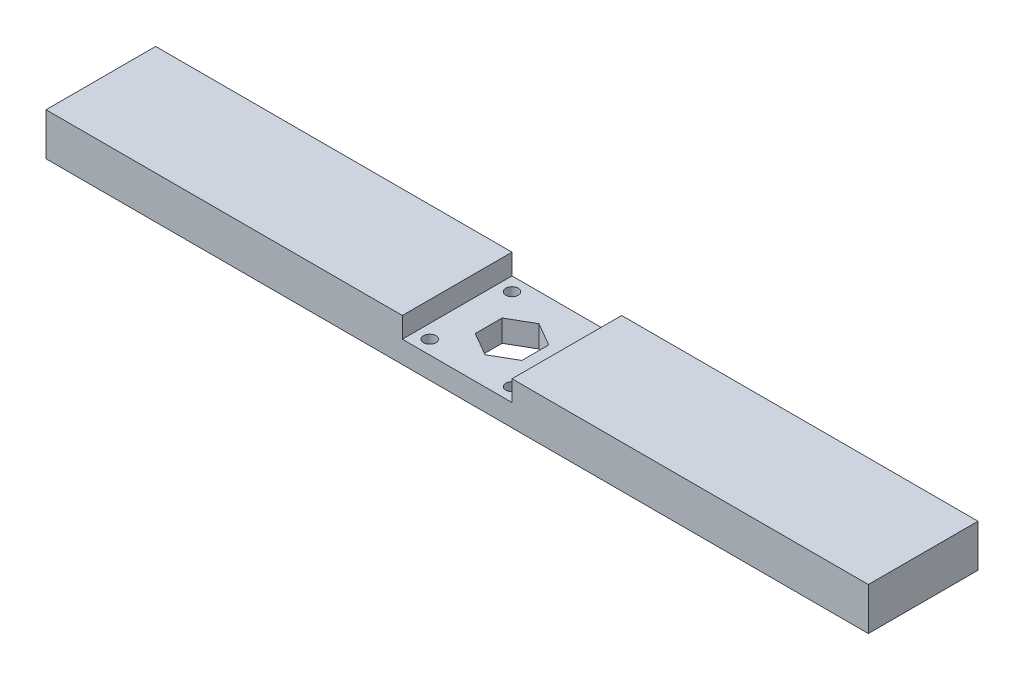
ISO-10303-21;
HEADER;
FILE_DESCRIPTION(('STEP AP214'),'2;1');
FILE_NAME('part.step','',(''),(''),'','','');
FILE_SCHEMA(('AUTOMOTIVE_DESIGN { 1 0 10303 214 1 1 1 1 }'));
ENDSEC;
DATA;
#1=APPLICATION_CONTEXT('core data for automotive mechanical design processes');
#2=APPLICATION_PROTOCOL_DEFINITION('international standard','automotive_design',2000,#1);
#3=PRODUCT_CONTEXT('',#1,'mechanical');
#4=PRODUCT('Part','Part','',(#3));
#5=PRODUCT_RELATED_PRODUCT_CATEGORY('part','',(#4));
#6=PRODUCT_DEFINITION_FORMATION('','',#4);
#7=PRODUCT_DEFINITION_CONTEXT('part definition',#1,'design');
#8=PRODUCT_DEFINITION('design','',#6,#7);
#9=PRODUCT_DEFINITION_SHAPE('','',#8);
#10=(LENGTH_UNIT() NAMED_UNIT(*) SI_UNIT(.MILLI.,.METRE.));
#11=(NAMED_UNIT(*) PLANE_ANGLE_UNIT() SI_UNIT($,.RADIAN.));
#12=(NAMED_UNIT(*) SI_UNIT($,.STERADIAN.) SOLID_ANGLE_UNIT());
#13=UNCERTAINTY_MEASURE_WITH_UNIT(LENGTH_MEASURE(1.E-05),#10,'distance_accuracy_value','');
#14=(GEOMETRIC_REPRESENTATION_CONTEXT(3) GLOBAL_UNCERTAINTY_ASSIGNED_CONTEXT((#13)) GLOBAL_UNIT_ASSIGNED_CONTEXT((#10,
#11,#12)) REPRESENTATION_CONTEXT('',''));
#15=CARTESIAN_POINT('',(0.,0.,0.));
#16=DIRECTION('',(0.,0.,1.));
#17=DIRECTION('',(1.,0.,0.));
#18=AXIS2_PLACEMENT_3D('',#15,#16,#17);
#19=CARTESIAN_POINT('',(-150.,7.75,20.));
#20=DIRECTION('',(0.,-1.,0.));
#21=DIRECTION('',(0.,0.,-1.));
#22=AXIS2_PLACEMENT_3D('',#19,#20,#21);
#23=PLANE('',#22);
#24=DIRECTION('',(-1.,0.,0.));
#25=VECTOR('',#24,1.);
#26=CARTESIAN_POINT('',(-150.,7.75,-20.));
#27=LINE('',#26,#25);
#28=CARTESIAN_POINT('',(-20.,7.75,-20.));
#29=VERTEX_POINT('',#28);
#30=CARTESIAN_POINT('',(-150.,7.75,-20.));
#31=VERTEX_POINT('',#30);
#32=EDGE_CURVE('E209',#29,#31,#27,.T.);
#33=ORIENTED_EDGE('',*,*,#32,.T.);
#34=DIRECTION('',(0.,0.,-1.));
#35=VECTOR('',#34,1.);
#36=CARTESIAN_POINT('',(-150.,7.75,20.));
#37=LINE('',#36,#35);
#38=CARTESIAN_POINT('',(-150.,7.75,20.));
#39=VERTEX_POINT('',#38);
#40=EDGE_CURVE('E11',#39,#31,#37,.T.);
#41=ORIENTED_EDGE('',*,*,#40,.F.);
#42=DIRECTION('',(-1.,0.,0.));
#43=VECTOR('',#42,1.);
#44=CARTESIAN_POINT('',(-150.,7.75,20.));
#45=LINE('',#44,#43);
#46=CARTESIAN_POINT('',(-20.,7.75,20.));
#47=VERTEX_POINT('',#46);
#48=EDGE_CURVE('E210',#47,#39,#45,.T.);
#49=ORIENTED_EDGE('',*,*,#48,.F.);
#50=DIRECTION('',(0.,0.,-1.));
#51=VECTOR('',#50,1.);
#52=CARTESIAN_POINT('',(-20.,7.75,20.));
#53=LINE('',#52,#51);
#54=EDGE_CURVE('E228',#47,#29,#53,.T.);
#55=ORIENTED_EDGE('',*,*,#54,.T.);
#56=EDGE_LOOP('',(#33,#41,#49,#55));
#57=FACE_BOUND('',#56,.T.);
#58=ADVANCED_FACE('F33',(#57),#23,.F.);
#59=CARTESIAN_POINT('',(-150.,7.75,20.));
#60=DIRECTION('',(1.,0.,0.));
#61=DIRECTION('',(0.,0.,-1.));
#62=AXIS2_PLACEMENT_3D('',#59,#60,#61);
#63=PLANE('',#62);
#64=DIRECTION('',(0.,-1.,0.));
#65=VECTOR('',#64,1.);
#66=CARTESIAN_POINT('',(-150.,7.75,-20.));
#67=LINE('',#66,#65);
#68=CARTESIAN_POINT('',(-150.,-7.75,-20.));
#69=VERTEX_POINT('',#68);
#70=EDGE_CURVE('E231',#31,#69,#67,.T.);
#71=ORIENTED_EDGE('',*,*,#70,.T.);
#72=DIRECTION('',(0.,0.,-1.));
#73=VECTOR('',#72,1.);
#74=CARTESIAN_POINT('',(-150.,-7.75,20.));
#75=LINE('',#74,#73);
#76=CARTESIAN_POINT('',(-150.,-7.75,20.));
#77=VERTEX_POINT('',#76);
#78=EDGE_CURVE('E40',#77,#69,#75,.T.);
#79=ORIENTED_EDGE('',*,*,#78,.F.);
#80=DIRECTION('',(0.,-1.,0.));
#81=VECTOR('',#80,1.);
#82=CARTESIAN_POINT('',(-150.,7.75,20.));
#83=LINE('',#82,#81);
#84=EDGE_CURVE('E213',#39,#77,#83,.T.);
#85=ORIENTED_EDGE('',*,*,#84,.F.);
#86=ORIENTED_EDGE('',*,*,#40,.T.);
#87=EDGE_LOOP('',(#71,#79,#85,#86));
#88=FACE_BOUND('',#87,.T.);
#89=ADVANCED_FACE('F288',(#88),#63,.F.);
#90=CARTESIAN_POINT('',(-150.,-7.75,20.));
#91=DIRECTION('',(0.,1.,0.));
#92=DIRECTION('',(-1.,0.,0.));
#93=AXIS2_PLACEMENT_3D('',#90,#91,#92);
#94=PLANE('',#93);
#95=CARTESIAN_POINT('',(-15.,-7.75000000000001,-15.));
#96=DIRECTION('',(0.,1.,0.));
#97=DIRECTION('',(-1.,0.,0.));
#98=AXIS2_PLACEMENT_3D('',#95,#96,#97);
#99=CIRCLE('',#98,2.25);
#100=CARTESIAN_POINT('',(-17.25,-7.75000000000001,-15.));
#101=VERTEX_POINT('',#100);
#102=EDGE_CURVE('E206',#101,#101,#99,.T.);
#103=ORIENTED_EDGE('',*,*,#102,.T.);
#104=EDGE_LOOP('',(#103));
#105=FACE_BOUND('',#104,.T.);
#106=CARTESIAN_POINT('',(15.,-7.75000000000002,15.));
#107=DIRECTION('',(0.,1.,0.));
#108=DIRECTION('',(-1.,0.,0.));
#109=AXIS2_PLACEMENT_3D('',#106,#107,#108);
#110=CIRCLE('',#109,2.25);
#111=CARTESIAN_POINT('',(12.75,-7.75000000000002,15.));
#112=VERTEX_POINT('',#111);
#113=EDGE_CURVE('E203',#112,#112,#110,.T.);
#114=ORIENTED_EDGE('',*,*,#113,.T.);
#115=EDGE_LOOP('',(#114));
#116=FACE_BOUND('',#115,.T.);
#117=CARTESIAN_POINT('',(-15.,-7.75000000000001,15.));
#118=DIRECTION('',(0.,1.,0.));
#119=DIRECTION('',(-1.,0.,0.));
#120=AXIS2_PLACEMENT_3D('',#117,#118,#119);
#121=CIRCLE('',#120,2.25);
#122=CARTESIAN_POINT('',(-17.25,-7.75000000000001,15.));
#123=VERTEX_POINT('',#122);
#124=EDGE_CURVE('E200',#123,#123,#121,.T.);
#125=ORIENTED_EDGE('',*,*,#124,.T.);
#126=EDGE_LOOP('',(#125));
#127=FACE_BOUND('',#126,.T.);
#128=DIRECTION('',(0.,0.,1.));
#129=VECTOR('',#128,1.);
#130=CARTESIAN_POINT('',(-8.50000000000001,-7.75000000000002,20.));
#131=LINE('',#130,#129);
#132=CARTESIAN_POINT('',(-8.5,-7.75000000000001,-4.90747728811182));
#133=VERTEX_POINT('',#132);
#134=CARTESIAN_POINT('',(-8.5,-7.75000000000001,4.90747728811182));
#135=VERTEX_POINT('',#134);
#136=EDGE_CURVE('E194',#133,#135,#131,.T.);
#137=ORIENTED_EDGE('',*,*,#136,.T.);
#138=DIRECTION('',(0.866025403784439,0.,0.5));
#139=VECTOR('',#138,1.);
#140=CARTESIAN_POINT('',(-108.089745962156,-7.75000000000001,-52.5906893516652));
#141=LINE('',#140,#139);
#142=CARTESIAN_POINT('',(0.,-7.75000000000002,9.81495457622364));
#143=VERTEX_POINT('',#142);
#144=EDGE_CURVE('E197',#135,#143,#141,.T.);
#145=ORIENTED_EDGE('',*,*,#144,.T.);
#146=DIRECTION('',(0.866025403784438,0.,-0.500000000000001));
#147=VECTOR('',#146,1.);
#148=CARTESIAN_POINT('',(-116.910254037844,-7.75,77.3131212160007));
#149=LINE('',#148,#147);
#150=CARTESIAN_POINT('',(8.50000000000001,-7.75000000000002,4.90747728811182));
#151=VERTEX_POINT('',#150);
#152=EDGE_CURVE('E185',#143,#151,#149,.T.);
#153=ORIENTED_EDGE('',*,*,#152,.T.);
#154=DIRECTION('',(0.,0.,-1.));
#155=VECTOR('',#154,1.);
#156=CARTESIAN_POINT('',(8.50000000000001,-7.75000000000002,20.));
#157=LINE('',#156,#155);
#158=CARTESIAN_POINT('',(8.5,-7.75000000000002,-4.90747728811182));
#159=VERTEX_POINT('',#158);
#160=EDGE_CURVE('E139',#151,#159,#157,.T.);
#161=ORIENTED_EDGE('',*,*,#160,.T.);
#162=DIRECTION('',(-0.866025403784439,0.,-0.5));
#163=VECTOR('',#162,1.);
#164=CARTESIAN_POINT('',(-99.5897459621556,-7.75000000000001,-67.3131212160007));
#165=LINE('',#164,#163);
#166=CARTESIAN_POINT('',(0.,-7.75000000000002,-9.81495457622364));
#167=VERTEX_POINT('',#166);
#168=EDGE_CURVE('E188',#159,#167,#165,.T.);
#169=ORIENTED_EDGE('',*,*,#168,.T.);
#170=DIRECTION('',(-0.866025403784439,0.,0.5));
#171=VECTOR('',#170,1.);
#172=CARTESIAN_POINT('',(-125.410254037844,-7.75,62.5906893516652));
#173=LINE('',#172,#171);
#174=EDGE_CURVE('E191',#167,#133,#173,.T.);
#175=ORIENTED_EDGE('',*,*,#174,.T.);
#176=EDGE_LOOP('',(#137,#145,#153,#161,#169,#175));
#177=FACE_BOUND('',#176,.T.);
#178=CARTESIAN_POINT('',(15.,-7.75000000000002,-15.));
#179=DIRECTION('',(0.,1.,0.));
#180=DIRECTION('',(-1.,0.,0.));
#181=AXIS2_PLACEMENT_3D('',#178,#179,#180);
#182=CIRCLE('',#181,2.25);
#183=CARTESIAN_POINT('',(12.75,-7.75000000000002,-15.));
#184=VERTEX_POINT('',#183);
#185=EDGE_CURVE('E182',#184,#184,#182,.T.);
#186=ORIENTED_EDGE('',*,*,#185,.T.);
#187=EDGE_LOOP('',(#186));
#188=FACE_BOUND('',#187,.T.);
#189=DIRECTION('',(1.,0.,0.));
#190=VECTOR('',#189,1.);
#191=CARTESIAN_POINT('',(-150.,-7.75,-20.));
#192=LINE('',#191,#190);
#193=CARTESIAN_POINT('',(150.,-7.75000000000004,-20.));
#194=VERTEX_POINT('',#193);
#195=EDGE_CURVE('E233',#69,#194,#192,.T.);
#196=ORIENTED_EDGE('',*,*,#195,.T.);
#197=DIRECTION('',(0.,0.,-1.));
#198=VECTOR('',#197,1.);
#199=CARTESIAN_POINT('',(150.,-7.75000000000004,20.));
#200=LINE('',#199,#198);
#201=CARTESIAN_POINT('',(150.,-7.75000000000004,20.));
#202=VERTEX_POINT('',#201);
#203=EDGE_CURVE('E258',#202,#194,#200,.T.);
#204=ORIENTED_EDGE('',*,*,#203,.F.);
#205=DIRECTION('',(1.,0.,0.));
#206=VECTOR('',#205,1.);
#207=CARTESIAN_POINT('',(-150.,-7.75,20.));
#208=LINE('',#207,#206);
#209=EDGE_CURVE('E216',#77,#202,#208,.T.);
#210=ORIENTED_EDGE('',*,*,#209,.F.);
#211=ORIENTED_EDGE('',*,*,#78,.T.);
#212=EDGE_LOOP('',(#196,#204,#210,#211));
#213=FACE_BOUND('',#212,.T.);
#214=ADVANCED_FACE('F265',(#105,#116,#127,#177,#188,#213),#94,.F.);
#215=CARTESIAN_POINT('',(150.,7.75000000000004,20.));
#216=DIRECTION('',(-1.,0.,0.));
#217=DIRECTION('',(0.,0.,1.));
#218=AXIS2_PLACEMENT_3D('',#215,#216,#217);
#219=PLANE('',#218);
#220=DIRECTION('',(0.,1.,0.));
#221=VECTOR('',#220,1.);
#222=CARTESIAN_POINT('',(150.,7.75000000000004,-20.));
#223=LINE('',#222,#221);
#224=CARTESIAN_POINT('',(150.,7.75000000000004,-20.));
#225=VERTEX_POINT('',#224);
#226=EDGE_CURVE('E235',#194,#225,#223,.T.);
#227=ORIENTED_EDGE('',*,*,#226,.T.);
#228=DIRECTION('',(0.,0.,-1.));
#229=VECTOR('',#228,1.);
#230=CARTESIAN_POINT('',(150.,7.75000000000004,20.));
#231=LINE('',#230,#229);
#232=CARTESIAN_POINT('',(150.,7.75000000000004,20.));
#233=VERTEX_POINT('',#232);
#234=EDGE_CURVE('E255',#233,#225,#231,.T.);
#235=ORIENTED_EDGE('',*,*,#234,.F.);
#236=DIRECTION('',(0.,1.,0.));
#237=VECTOR('',#236,1.);
#238=CARTESIAN_POINT('',(150.,7.75000000000004,20.));
#239=LINE('',#238,#237);
#240=EDGE_CURVE('E218',#202,#233,#239,.T.);
#241=ORIENTED_EDGE('',*,*,#240,.F.);
#242=ORIENTED_EDGE('',*,*,#203,.T.);
#243=EDGE_LOOP('',(#227,#235,#241,#242));
#244=FACE_BOUND('',#243,.T.);
#245=ADVANCED_FACE('F276',(#244),#219,.F.);
#246=CARTESIAN_POINT('',(150.,7.75000000000004,20.));
#247=DIRECTION('',(0.,-1.,0.));
#248=DIRECTION('',(1.,0.,0.));
#249=AXIS2_PLACEMENT_3D('',#246,#247,#248);
#250=PLANE('',#249);
#251=DIRECTION('',(-1.,0.,0.));
#252=VECTOR('',#251,1.);
#253=CARTESIAN_POINT('',(150.,7.75000000000004,-20.));
#254=LINE('',#253,#252);
#255=CARTESIAN_POINT('',(20.,7.75000000000001,-20.));
#256=VERTEX_POINT('',#255);
#257=EDGE_CURVE('E237',#225,#256,#254,.T.);
#258=ORIENTED_EDGE('',*,*,#257,.T.);
#259=DIRECTION('',(0.,0.,-1.));
#260=VECTOR('',#259,1.);
#261=CARTESIAN_POINT('',(20.,7.75000000000001,20.));
#262=LINE('',#261,#260);
#263=CARTESIAN_POINT('',(20.,7.75000000000001,20.));
#264=VERTEX_POINT('',#263);
#265=EDGE_CURVE('E252',#264,#256,#262,.T.);
#266=ORIENTED_EDGE('',*,*,#265,.F.);
#267=DIRECTION('',(-1.,0.,0.));
#268=VECTOR('',#267,1.);
#269=CARTESIAN_POINT('',(150.,7.75000000000004,20.));
#270=LINE('',#269,#268);
#271=EDGE_CURVE('E220',#233,#264,#270,.T.);
#272=ORIENTED_EDGE('',*,*,#271,.F.);
#273=ORIENTED_EDGE('',*,*,#234,.T.);
#274=EDGE_LOOP('',(#258,#266,#272,#273));
#275=FACE_BOUND('',#274,.T.);
#276=ADVANCED_FACE('F280',(#275),#250,.F.);
#277=CARTESIAN_POINT('',(20.,7.75000000000001,20.));
#278=DIRECTION('',(1.,0.,0.));
#279=DIRECTION('',(0.,1.,0.));
#280=AXIS2_PLACEMENT_3D('',#277,#278,#279);
#281=PLANE('',#280);
#282=DIRECTION('',(0.,-1.,0.));
#283=VECTOR('',#282,1.);
#284=CARTESIAN_POINT('',(20.,7.75000000000001,-20.));
#285=LINE('',#284,#283);
#286=CARTESIAN_POINT('',(20.,0.250000000000005,-20.));
#287=VERTEX_POINT('',#286);
#288=EDGE_CURVE('E239',#256,#287,#285,.T.);
#289=ORIENTED_EDGE('',*,*,#288,.T.);
#290=DIRECTION('',(0.,0.,-1.));
#291=VECTOR('',#290,1.);
#292=CARTESIAN_POINT('',(20.,0.250000000000005,20.));
#293=LINE('',#292,#291);
#294=CARTESIAN_POINT('',(20.,0.250000000000005,20.));
#295=VERTEX_POINT('',#294);
#296=EDGE_CURVE('E249',#295,#287,#293,.T.);
#297=ORIENTED_EDGE('',*,*,#296,.F.);
#298=DIRECTION('',(0.,-1.,0.));
#299=VECTOR('',#298,1.);
#300=CARTESIAN_POINT('',(20.,7.75000000000001,20.));
#301=LINE('',#300,#299);
#302=EDGE_CURVE('E222',#264,#295,#301,.T.);
#303=ORIENTED_EDGE('',*,*,#302,.F.);
#304=ORIENTED_EDGE('',*,*,#265,.T.);
#305=EDGE_LOOP('',(#289,#297,#303,#304));
#306=FACE_BOUND('',#305,.T.);
#307=ADVANCED_FACE('F300',(#306),#281,.F.);
#308=CARTESIAN_POINT('',(-20.,0.25,20.));
#309=DIRECTION('',(0.,-1.,0.));
#310=DIRECTION('',(1.,0.,0.));
#311=AXIS2_PLACEMENT_3D('',#308,#309,#310);
#312=PLANE('',#311);
#313=CARTESIAN_POINT('',(-15.,0.250000000000003,-15.));
#314=DIRECTION('',(0.,1.,0.));
#315=DIRECTION('',(0.,0.,-1.));
#316=AXIS2_PLACEMENT_3D('',#313,#314,#315);
#317=CIRCLE('',#316,2.25);
#318=CARTESIAN_POINT('',(-15.,0.250000000000003,-17.25));
#319=VERTEX_POINT('',#318);
#320=EDGE_CURVE('E173',#319,#319,#317,.T.);
#321=ORIENTED_EDGE('',*,*,#320,.F.);
#322=EDGE_LOOP('',(#321));
#323=FACE_BOUND('',#322,.T.);
#324=CARTESIAN_POINT('',(15.,0.250000000000003,15.));
#325=DIRECTION('',(0.,1.,0.));
#326=DIRECTION('',(0.,0.,-1.));
#327=AXIS2_PLACEMENT_3D('',#324,#325,#326);
#328=CIRCLE('',#327,2.25);
#329=CARTESIAN_POINT('',(15.,0.250000000000003,12.75));
#330=VERTEX_POINT('',#329);
#331=EDGE_CURVE('E177',#330,#330,#328,.T.);
#332=ORIENTED_EDGE('',*,*,#331,.F.);
#333=EDGE_LOOP('',(#332));
#334=FACE_BOUND('',#333,.T.);
#335=CARTESIAN_POINT('',(-15.,0.250000000000003,15.));
#336=DIRECTION('',(0.,1.,0.));
#337=DIRECTION('',(0.,0.,1.));
#338=AXIS2_PLACEMENT_3D('',#335,#336,#337);
#339=CIRCLE('',#338,2.25);
#340=CARTESIAN_POINT('',(-15.,0.250000000000003,17.25));
#341=VERTEX_POINT('',#340);
#342=EDGE_CURVE('E166',#341,#341,#339,.T.);
#343=ORIENTED_EDGE('',*,*,#342,.F.);
#344=EDGE_LOOP('',(#343));
#345=FACE_BOUND('',#344,.T.);
#346=DIRECTION('',(0.866025403784438,0.,-0.500000000000001));
#347=VECTOR('',#346,1.);
#348=CARTESIAN_POINT('',(0.,0.250000000000003,9.81495457622364));
#349=LINE('',#348,#347);
#350=CARTESIAN_POINT('',(0.,0.250000000000003,9.81495457622364));
#351=VERTEX_POINT('',#350);
#352=CARTESIAN_POINT('',(8.5,0.250000000000003,4.90747728811181));
#353=VERTEX_POINT('',#352);
#354=EDGE_CURVE('E145',#351,#353,#349,.T.);
#355=ORIENTED_EDGE('',*,*,#354,.F.);
#356=DIRECTION('',(0.866025403784439,0.,0.5));
#357=VECTOR('',#356,1.);
#358=CARTESIAN_POINT('',(-8.5,0.250000000000003,4.90747728811182));
#359=LINE('',#358,#357);
#360=CARTESIAN_POINT('',(-8.5,0.250000000000003,4.90747728811182));
#361=VERTEX_POINT('',#360);
#362=EDGE_CURVE('E55',#361,#351,#359,.T.);
#363=ORIENTED_EDGE('',*,*,#362,.F.);
#364=DIRECTION('',(0.,0.,1.));
#365=VECTOR('',#364,1.);
#366=CARTESIAN_POINT('',(-8.5,0.250000000000003,-4.90747728811182));
#367=LINE('',#366,#365);
#368=CARTESIAN_POINT('',(-8.5,0.250000000000003,-4.90747728811182));
#369=VERTEX_POINT('',#368);
#370=EDGE_CURVE('E161',#369,#361,#367,.T.);
#371=ORIENTED_EDGE('',*,*,#370,.F.);
#372=DIRECTION('',(-0.866025403784439,0.,0.5));
#373=VECTOR('',#372,1.);
#374=CARTESIAN_POINT('',(0.,0.250000000000003,-9.81495457622364));
#375=LINE('',#374,#373);
#376=CARTESIAN_POINT('',(0.,0.250000000000003,-9.81495457622364));
#377=VERTEX_POINT('',#376);
#378=EDGE_CURVE('E155',#377,#369,#375,.T.);
#379=ORIENTED_EDGE('',*,*,#378,.F.);
#380=DIRECTION('',(-0.866025403784438,0.,-0.5));
#381=VECTOR('',#380,1.);
#382=CARTESIAN_POINT('',(8.5,0.250000000000003,-4.90747728811182));
#383=LINE('',#382,#381);
#384=CARTESIAN_POINT('',(8.5,0.250000000000003,-4.90747728811182));
#385=VERTEX_POINT('',#384);
#386=EDGE_CURVE('E153',#385,#377,#383,.T.);
#387=ORIENTED_EDGE('',*,*,#386,.F.);
#388=DIRECTION('',(0.,0.,-1.));
#389=VECTOR('',#388,1.);
#390=CARTESIAN_POINT('',(8.5,0.250000000000003,4.90747728811181));
#391=LINE('',#390,#389);
#392=EDGE_CURVE('E136',#353,#385,#391,.T.);
#393=ORIENTED_EDGE('',*,*,#392,.F.);
#394=EDGE_LOOP('',(#355,#363,#371,#379,#387,#393));
#395=FACE_BOUND('',#394,.T.);
#396=CARTESIAN_POINT('',(15.,0.250000000000003,-15.));
#397=DIRECTION('',(0.,1.,0.));
#398=DIRECTION('',(0.,0.,1.));
#399=AXIS2_PLACEMENT_3D('',#396,#397,#398);
#400=CIRCLE('',#399,2.25);
#401=CARTESIAN_POINT('',(15.,0.250000000000003,-12.75));
#402=VERTEX_POINT('',#401);
#403=EDGE_CURVE('E176',#402,#402,#400,.T.);
#404=ORIENTED_EDGE('',*,*,#403,.F.);
#405=EDGE_LOOP('',(#404));
#406=FACE_BOUND('',#405,.T.);
#407=DIRECTION('',(-1.,0.,0.));
#408=VECTOR('',#407,1.);
#409=CARTESIAN_POINT('',(-20.,0.25,-20.));
#410=LINE('',#409,#408);
#411=CARTESIAN_POINT('',(-20.,0.25,-20.));
#412=VERTEX_POINT('',#411);
#413=EDGE_CURVE('E241',#287,#412,#410,.T.);
#414=ORIENTED_EDGE('',*,*,#413,.T.);
#415=DIRECTION('',(0.,0.,-1.));
#416=VECTOR('',#415,1.);
#417=CARTESIAN_POINT('',(-20.,0.25,20.));
#418=LINE('',#417,#416);
#419=CARTESIAN_POINT('',(-20.,0.25,20.));
#420=VERTEX_POINT('',#419);
#421=EDGE_CURVE('E246',#420,#412,#418,.T.);
#422=ORIENTED_EDGE('',*,*,#421,.F.);
#423=DIRECTION('',(-1.,0.,0.));
#424=VECTOR('',#423,1.);
#425=CARTESIAN_POINT('',(-20.,0.25,20.));
#426=LINE('',#425,#424);
#427=EDGE_CURVE('E224',#295,#420,#426,.T.);
#428=ORIENTED_EDGE('',*,*,#427,.F.);
#429=ORIENTED_EDGE('',*,*,#296,.T.);
#430=EDGE_LOOP('',(#414,#422,#428,#429));
#431=FACE_BOUND('',#430,.T.);
#432=ADVANCED_FACE('F149',(#323,#334,#345,#395,#406,#431),#312,.F.);
#433=CARTESIAN_POINT('',(-20.,7.75,20.));
#434=DIRECTION('',(-1.,0.,0.));
#435=DIRECTION('',(0.,-1.,0.));
#436=AXIS2_PLACEMENT_3D('',#433,#434,#435);
#437=PLANE('',#436);
#438=DIRECTION('',(0.,1.,0.));
#439=VECTOR('',#438,1.);
#440=CARTESIAN_POINT('',(-20.,7.75,-20.));
#441=LINE('',#440,#439);
#442=EDGE_CURVE('E214',#412,#29,#441,.T.);
#443=ORIENTED_EDGE('',*,*,#442,.T.);
#444=ORIENTED_EDGE('',*,*,#54,.F.);
#445=DIRECTION('',(0.,1.,0.));
#446=VECTOR('',#445,1.);
#447=CARTESIAN_POINT('',(-20.,7.75,20.));
#448=LINE('',#447,#446);
#449=EDGE_CURVE('E226',#420,#47,#448,.T.);
#450=ORIENTED_EDGE('',*,*,#449,.F.);
#451=ORIENTED_EDGE('',*,*,#421,.T.);
#452=EDGE_LOOP('',(#443,#444,#450,#451));
#453=FACE_BOUND('',#452,.T.);
#454=ADVANCED_FACE('F294',(#453),#437,.F.);
#455=CARTESIAN_POINT('',(0.,0.,20.));
#456=DIRECTION('',(0.,0.,-1.));
#457=DIRECTION('',(-1.,0.,0.));
#458=AXIS2_PLACEMENT_3D('',#455,#456,#457);
#459=PLANE('',#458);
#460=ORIENTED_EDGE('',*,*,#48,.T.);
#461=ORIENTED_EDGE('',*,*,#84,.T.);
#462=ORIENTED_EDGE('',*,*,#209,.T.);
#463=ORIENTED_EDGE('',*,*,#240,.T.);
#464=ORIENTED_EDGE('',*,*,#271,.T.);
#465=ORIENTED_EDGE('',*,*,#302,.T.);
#466=ORIENTED_EDGE('',*,*,#427,.T.);
#467=ORIENTED_EDGE('',*,*,#449,.T.);
#468=EDGE_LOOP('',(#460,#461,#462,#463,#464,#465,#466,#467));
#469=FACE_BOUND('',#468,.T.);
#470=ADVANCED_FACE('F284',(#469),#459,.F.);
#471=CARTESIAN_POINT('',(0.,0.,-20.));
#472=DIRECTION('',(0.,0.,-1.));
#473=DIRECTION('',(-1.,0.,0.));
#474=AXIS2_PLACEMENT_3D('',#471,#472,#473);
#475=PLANE('',#474);
#476=ORIENTED_EDGE('',*,*,#32,.F.);
#477=ORIENTED_EDGE('',*,*,#442,.F.);
#478=ORIENTED_EDGE('',*,*,#413,.F.);
#479=ORIENTED_EDGE('',*,*,#288,.F.);
#480=ORIENTED_EDGE('',*,*,#257,.F.);
#481=ORIENTED_EDGE('',*,*,#226,.F.);
#482=ORIENTED_EDGE('',*,*,#195,.F.);
#483=ORIENTED_EDGE('',*,*,#70,.F.);
#484=EDGE_LOOP('',(#476,#477,#478,#479,#480,#481,#482,#483));
#485=FACE_BOUND('',#484,.T.);
#486=ADVANCED_FACE('F271',(#485),#475,.T.);
#487=CARTESIAN_POINT('',(15.,-39.75,-15.));
#488=DIRECTION('',(0.,1.,0.));
#489=DIRECTION('',(0.,0.,1.));
#490=AXIS2_PLACEMENT_3D('',#487,#488,#489);
#491=CYLINDRICAL_SURFACE('',#490,2.25);
#492=ORIENTED_EDGE('',*,*,#403,.T.);
#493=EDGE_LOOP('',(#492));
#494=FACE_BOUND('',#493,.T.);
#495=ORIENTED_EDGE('',*,*,#185,.F.);
#496=EDGE_LOOP('',(#495));
#497=FACE_BOUND('',#496,.T.);
#498=ADVANCED_FACE('F358',(#494,#497),#491,.F.);
#499=CARTESIAN_POINT('',(-8.5,-39.75,4.90747728811182));
#500=DIRECTION('',(-0.5,0.,0.866025403784438));
#501=DIRECTION('',(0.866025403784439,0.,0.5));
#502=AXIS2_PLACEMENT_3D('',#499,#500,#501);
#503=PLANE('',#502);
#504=DIRECTION('',(0.,1.,0.));
#505=VECTOR('',#504,1.);
#506=CARTESIAN_POINT('',(-8.5,-39.75,4.90747728811182));
#507=LINE('',#506,#505);
#508=EDGE_CURVE('E164',#135,#361,#507,.T.);
#509=ORIENTED_EDGE('',*,*,#508,.T.);
#510=ORIENTED_EDGE('',*,*,#362,.T.);
#511=DIRECTION('',(0.,1.,0.));
#512=VECTOR('',#511,1.);
#513=CARTESIAN_POINT('',(0.,-39.75,9.81495457622364));
#514=LINE('',#513,#512);
#515=EDGE_CURVE('E142',#143,#351,#514,.T.);
#516=ORIENTED_EDGE('',*,*,#515,.F.);
#517=ORIENTED_EDGE('',*,*,#144,.F.);
#518=EDGE_LOOP('',(#509,#510,#516,#517));
#519=FACE_BOUND('',#518,.T.);
#520=ADVANCED_FACE('F378',(#519),#503,.F.);
#521=CARTESIAN_POINT('',(-8.5,-39.75,-4.90747728811182));
#522=DIRECTION('',(-1.,0.,0.));
#523=DIRECTION('',(0.,0.,1.));
#524=AXIS2_PLACEMENT_3D('',#521,#522,#523);
#525=PLANE('',#524);
#526=DIRECTION('',(0.,1.,0.));
#527=VECTOR('',#526,1.);
#528=CARTESIAN_POINT('',(-8.5,-39.75,-4.90747728811182));
#529=LINE('',#528,#527);
#530=EDGE_CURVE('E167',#133,#369,#529,.T.);
#531=ORIENTED_EDGE('',*,*,#530,.T.);
#532=ORIENTED_EDGE('',*,*,#370,.T.);
#533=ORIENTED_EDGE('',*,*,#508,.F.);
#534=ORIENTED_EDGE('',*,*,#136,.F.);
#535=EDGE_LOOP('',(#531,#532,#533,#534));
#536=FACE_BOUND('',#535,.T.);
#537=ADVANCED_FACE('F388',(#536),#525,.F.);
#538=CARTESIAN_POINT('',(0.,-39.75,-9.81495457622364));
#539=DIRECTION('',(-0.5,0.,-0.866025403784439));
#540=DIRECTION('',(-0.866025403784439,0.,0.5));
#541=AXIS2_PLACEMENT_3D('',#538,#539,#540);
#542=PLANE('',#541);
#543=DIRECTION('',(0.,1.,0.));
#544=VECTOR('',#543,1.);
#545=CARTESIAN_POINT('',(0.,-39.75,-9.81495457622364));
#546=LINE('',#545,#544);
#547=EDGE_CURVE('E169',#167,#377,#546,.T.);
#548=ORIENTED_EDGE('',*,*,#547,.T.);
#549=ORIENTED_EDGE('',*,*,#378,.T.);
#550=ORIENTED_EDGE('',*,*,#530,.F.);
#551=ORIENTED_EDGE('',*,*,#174,.F.);
#552=EDGE_LOOP('',(#548,#549,#550,#551));
#553=FACE_BOUND('',#552,.T.);
#554=ADVANCED_FACE('F397',(#553),#542,.F.);
#555=CARTESIAN_POINT('',(8.5,-39.75,-4.90747728811182));
#556=DIRECTION('',(0.5,0.,-0.866025403784439));
#557=DIRECTION('',(-0.866025403784439,0.,-0.5));
#558=AXIS2_PLACEMENT_3D('',#555,#556,#557);
#559=PLANE('',#558);
#560=DIRECTION('',(0.,1.,0.));
#561=VECTOR('',#560,1.);
#562=CARTESIAN_POINT('',(8.5,-39.75,-4.90747728811182));
#563=LINE('',#562,#561);
#564=EDGE_CURVE('E141',#159,#385,#563,.T.);
#565=ORIENTED_EDGE('',*,*,#564,.T.);
#566=ORIENTED_EDGE('',*,*,#386,.T.);
#567=ORIENTED_EDGE('',*,*,#547,.F.);
#568=ORIENTED_EDGE('',*,*,#168,.F.);
#569=EDGE_LOOP('',(#565,#566,#567,#568));
#570=FACE_BOUND('',#569,.T.);
#571=ADVANCED_FACE('F407',(#570),#559,.F.);
#572=CARTESIAN_POINT('',(8.5,-39.75,4.90747728811181));
#573=DIRECTION('',(1.,0.,0.));
#574=DIRECTION('',(0.,0.,-1.));
#575=AXIS2_PLACEMENT_3D('',#572,#573,#574);
#576=PLANE('',#575);
#577=DIRECTION('',(0.,1.,0.));
#578=VECTOR('',#577,1.);
#579=CARTESIAN_POINT('',(8.5,-39.75,4.90747728811181));
#580=LINE('',#579,#578);
#581=EDGE_CURVE('E47',#151,#353,#580,.T.);
#582=ORIENTED_EDGE('',*,*,#581,.T.);
#583=ORIENTED_EDGE('',*,*,#392,.T.);
#584=ORIENTED_EDGE('',*,*,#564,.F.);
#585=ORIENTED_EDGE('',*,*,#160,.F.);
#586=EDGE_LOOP('',(#582,#583,#584,#585));
#587=FACE_BOUND('',#586,.T.);
#588=ADVANCED_FACE('F133',(#587),#576,.F.);
#589=CARTESIAN_POINT('',(0.,-39.75,9.81495457622364));
#590=DIRECTION('',(0.500000000000001,0.,0.866025403784438));
#591=DIRECTION('',(0.866025403784438,0.,-0.500000000000001));
#592=AXIS2_PLACEMENT_3D('',#589,#590,#591);
#593=PLANE('',#592);
#594=ORIENTED_EDGE('',*,*,#515,.T.);
#595=ORIENTED_EDGE('',*,*,#354,.T.);
#596=ORIENTED_EDGE('',*,*,#581,.F.);
#597=ORIENTED_EDGE('',*,*,#152,.F.);
#598=EDGE_LOOP('',(#594,#595,#596,#597));
#599=FACE_BOUND('',#598,.T.);
#600=ADVANCED_FACE('F146',(#599),#593,.F.);
#601=CARTESIAN_POINT('',(-15.,-39.75,15.));
#602=DIRECTION('',(0.,1.,0.));
#603=DIRECTION('',(0.,0.,1.));
#604=AXIS2_PLACEMENT_3D('',#601,#602,#603);
#605=CYLINDRICAL_SURFACE('',#604,2.25);
#606=ORIENTED_EDGE('',*,*,#342,.T.);
#607=EDGE_LOOP('',(#606));
#608=FACE_BOUND('',#607,.T.);
#609=ORIENTED_EDGE('',*,*,#124,.F.);
#610=EDGE_LOOP('',(#609));
#611=FACE_BOUND('',#610,.T.);
#612=ADVANCED_FACE('F434',(#608,#611),#605,.F.);
#613=CARTESIAN_POINT('',(15.,-39.75,15.));
#614=DIRECTION('',(0.,1.,0.));
#615=DIRECTION('',(0.,0.,1.));
#616=AXIS2_PLACEMENT_3D('',#613,#614,#615);
#617=CYLINDRICAL_SURFACE('',#616,2.25);
#618=ORIENTED_EDGE('',*,*,#331,.T.);
#619=EDGE_LOOP('',(#618));
#620=FACE_BOUND('',#619,.T.);
#621=ORIENTED_EDGE('',*,*,#113,.F.);
#622=EDGE_LOOP('',(#621));
#623=FACE_BOUND('',#622,.T.);
#624=ADVANCED_FACE('F443',(#620,#623),#617,.F.);
#625=CARTESIAN_POINT('',(-15.,-39.75,-15.));
#626=DIRECTION('',(0.,1.,0.));
#627=DIRECTION('',(0.,0.,1.));
#628=AXIS2_PLACEMENT_3D('',#625,#626,#627);
#629=CYLINDRICAL_SURFACE('',#628,2.25);
#630=ORIENTED_EDGE('',*,*,#320,.T.);
#631=EDGE_LOOP('',(#630));
#632=FACE_BOUND('',#631,.T.);
#633=ORIENTED_EDGE('',*,*,#102,.F.);
#634=EDGE_LOOP('',(#633));
#635=FACE_BOUND('',#634,.T.);
#636=ADVANCED_FACE('F453',(#632,#635),#629,.F.);
#637=CLOSED_SHELL('',(#58,#89,#214,#245,#276,#307,#432,#454,#470,#486,#498,#520,#537,#554,#571,
#588,#600,#612,#624,#636));
#638=MANIFOLD_SOLID_BREP('B2',#637);
#639=ADVANCED_BREP_SHAPE_REPRESENTATION('',(#18,#638),#14);
#640=SHAPE_DEFINITION_REPRESENTATION(#9,#639);
ENDSEC;
END-ISO-10303-21;
